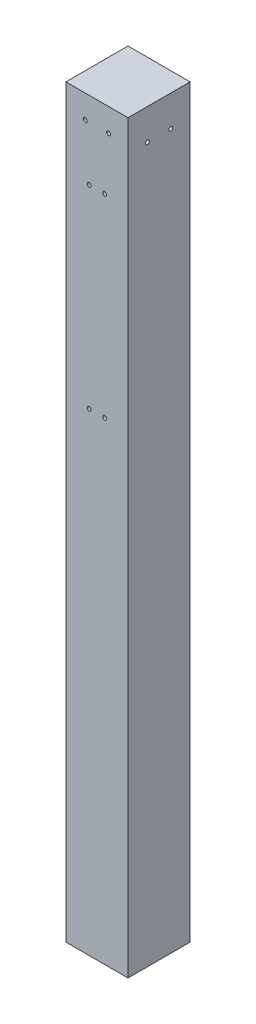
ISO-10303-21;
HEADER;
FILE_DESCRIPTION(('STEP AP214'),'2;1');
FILE_NAME('part.step','',(''),(''),'','','');
FILE_SCHEMA(('AUTOMOTIVE_DESIGN { 1 0 10303 214 1 1 1 1 }'));
ENDSEC;
DATA;
#1=APPLICATION_CONTEXT('core data for automotive mechanical design processes');
#2=APPLICATION_PROTOCOL_DEFINITION('international standard','automotive_design',2000,#1);
#3=PRODUCT_CONTEXT('',#1,'mechanical');
#4=PRODUCT('Part','Part','',(#3));
#5=PRODUCT_RELATED_PRODUCT_CATEGORY('part','',(#4));
#6=PRODUCT_DEFINITION_FORMATION('','',#4);
#7=PRODUCT_DEFINITION_CONTEXT('part definition',#1,'design');
#8=PRODUCT_DEFINITION('design','',#6,#7);
#9=PRODUCT_DEFINITION_SHAPE('','',#8);
#10=(LENGTH_UNIT() NAMED_UNIT(*) SI_UNIT(.MILLI.,.METRE.));
#11=(NAMED_UNIT(*) PLANE_ANGLE_UNIT() SI_UNIT($,.RADIAN.));
#12=(NAMED_UNIT(*) SI_UNIT($,.STERADIAN.) SOLID_ANGLE_UNIT());
#13=UNCERTAINTY_MEASURE_WITH_UNIT(LENGTH_MEASURE(1.E-05),#10,'distance_accuracy_value','');
#14=(GEOMETRIC_REPRESENTATION_CONTEXT(3) GLOBAL_UNCERTAINTY_ASSIGNED_CONTEXT((#13)) GLOBAL_UNIT_ASSIGNED_CONTEXT((#10,
#11,#12)) REPRESENTATION_CONTEXT('',''));
#15=CARTESIAN_POINT('',(0.,0.,0.));
#16=DIRECTION('',(0.,0.,1.));
#17=DIRECTION('',(1.,0.,0.));
#18=AXIS2_PLACEMENT_3D('',#15,#16,#17);
#19=CARTESIAN_POINT('',(-50.8,609.6,50.8));
#20=DIRECTION('',(1.,0.,0.));
#21=DIRECTION('',(0.,0.,-1.));
#22=AXIS2_PLACEMENT_3D('',#19,#20,#21);
#23=PLANE('',#22);
#24=CARTESIAN_POINT('',(-50.8,558.8,19.05));
#25=DIRECTION('',(1.,0.,0.));
#26=DIRECTION('',(0.,0.,-1.));
#27=AXIS2_PLACEMENT_3D('',#24,#25,#26);
#28=CIRCLE('',#27,3.175);
#29=CARTESIAN_POINT('',(-50.8,558.8,15.875));
#30=VERTEX_POINT('',#29);
#31=EDGE_CURVE('E104',#30,#30,#28,.T.);
#32=ORIENTED_EDGE('',*,*,#31,.T.);
#33=EDGE_LOOP('',(#32));
#34=FACE_BOUND('',#33,.T.);
#35=CARTESIAN_POINT('',(-50.8,558.8,-19.05));
#36=DIRECTION('',(1.,0.,0.));
#37=DIRECTION('',(0.,0.,-1.));
#38=AXIS2_PLACEMENT_3D('',#35,#36,#37);
#39=CIRCLE('',#38,3.175);
#40=CARTESIAN_POINT('',(-50.8,558.8,-22.225));
#41=VERTEX_POINT('',#40);
#42=EDGE_CURVE('E118',#41,#41,#39,.T.);
#43=ORIENTED_EDGE('',*,*,#42,.T.);
#44=EDGE_LOOP('',(#43));
#45=FACE_BOUND('',#44,.T.);
#46=DIRECTION('',(0.,0.,1.));
#47=VECTOR('',#46,1.);
#48=CARTESIAN_POINT('',(-50.8,-609.6,50.8));
#49=LINE('',#48,#47);
#50=CARTESIAN_POINT('',(-50.8,-609.6,-50.8));
#51=VERTEX_POINT('',#50);
#52=CARTESIAN_POINT('',(-50.8,-609.6,50.8));
#53=VERTEX_POINT('',#52);
#54=EDGE_CURVE('E101',#51,#53,#49,.T.);
#55=ORIENTED_EDGE('',*,*,#54,.T.);
#56=DIRECTION('',(0.,-1.,0.));
#57=VECTOR('',#56,1.);
#58=CARTESIAN_POINT('',(-50.8,609.6,50.8));
#59=LINE('',#58,#57);
#60=CARTESIAN_POINT('',(-50.8,609.6,50.8));
#61=VERTEX_POINT('',#60);
#62=EDGE_CURVE('E11',#61,#53,#59,.T.);
#63=ORIENTED_EDGE('',*,*,#62,.F.);
#64=DIRECTION('',(0.,0.,1.));
#65=VECTOR('',#64,1.);
#66=CARTESIAN_POINT('',(-50.8,609.6,50.8));
#67=LINE('',#66,#65);
#68=CARTESIAN_POINT('',(-50.8,609.6,-50.8));
#69=VERTEX_POINT('',#68);
#70=EDGE_CURVE('E89',#69,#61,#67,.T.);
#71=ORIENTED_EDGE('',*,*,#70,.F.);
#72=DIRECTION('',(0.,-1.,0.));
#73=VECTOR('',#72,1.);
#74=CARTESIAN_POINT('',(-50.8,609.6,-50.8));
#75=LINE('',#74,#73);
#76=EDGE_CURVE('E97',#69,#51,#75,.T.);
#77=ORIENTED_EDGE('',*,*,#76,.T.);
#78=EDGE_LOOP('',(#55,#63,#71,#77));
#79=FACE_BOUND('',#78,.T.);
#80=ADVANCED_FACE('F38',(#34,#45,#79),#23,.F.);
#81=CARTESIAN_POINT('',(50.8,609.6,50.8));
#82=DIRECTION('',(0.,0.,-1.));
#83=DIRECTION('',(-1.,0.,0.));
#84=AXIS2_PLACEMENT_3D('',#81,#82,#83);
#85=PLANE('',#84);
#86=CARTESIAN_POINT('',(12.7,482.6,50.8));
#87=DIRECTION('',(0.,0.,1.));
#88=DIRECTION('',(1.,0.,0.));
#89=AXIS2_PLACEMENT_3D('',#86,#87,#88);
#90=CIRCLE('',#89,3.175);
#91=CARTESIAN_POINT('',(15.875,482.6,50.8));
#92=VERTEX_POINT('',#91);
#93=EDGE_CURVE('E152',#92,#92,#90,.T.);
#94=ORIENTED_EDGE('',*,*,#93,.F.);
#95=EDGE_LOOP('',(#94));
#96=FACE_BOUND('',#95,.T.);
#97=CARTESIAN_POINT('',(-12.7,165.1,50.8));
#98=DIRECTION('',(0.,0.,1.));
#99=DIRECTION('',(1.,0.,0.));
#100=AXIS2_PLACEMENT_3D('',#97,#98,#99);
#101=CIRCLE('',#100,3.175);
#102=CARTESIAN_POINT('',(-9.52500000000001,165.1,50.8));
#103=VERTEX_POINT('',#102);
#104=EDGE_CURVE('E145',#103,#103,#101,.T.);
#105=ORIENTED_EDGE('',*,*,#104,.F.);
#106=EDGE_LOOP('',(#105));
#107=FACE_BOUND('',#106,.T.);
#108=CARTESIAN_POINT('',(12.7,165.1,50.8));
#109=DIRECTION('',(0.,0.,1.));
#110=DIRECTION('',(1.,0.,0.));
#111=AXIS2_PLACEMENT_3D('',#108,#109,#110);
#112=CIRCLE('',#111,3.175);
#113=CARTESIAN_POINT('',(15.875,165.1,50.8));
#114=VERTEX_POINT('',#113);
#115=EDGE_CURVE('E157',#114,#114,#112,.T.);
#116=ORIENTED_EDGE('',*,*,#115,.F.);
#117=EDGE_LOOP('',(#116));
#118=FACE_BOUND('',#117,.T.);
#119=CARTESIAN_POINT('',(-12.7,482.6,50.8));
#120=DIRECTION('',(0.,0.,1.));
#121=DIRECTION('',(1.,0.,0.));
#122=AXIS2_PLACEMENT_3D('',#119,#120,#121);
#123=CIRCLE('',#122,3.175);
#124=CARTESIAN_POINT('',(-9.52500000000001,482.6,50.8));
#125=VERTEX_POINT('',#124);
#126=EDGE_CURVE('E139',#125,#125,#123,.T.);
#127=ORIENTED_EDGE('',*,*,#126,.F.);
#128=EDGE_LOOP('',(#127));
#129=FACE_BOUND('',#128,.T.);
#130=CARTESIAN_POINT('',(-19.05,571.5,50.8));
#131=DIRECTION('',(0.,0.,1.));
#132=DIRECTION('',(1.,0.,0.));
#133=AXIS2_PLACEMENT_3D('',#130,#131,#132);
#134=CIRCLE('',#133,3.175);
#135=CARTESIAN_POINT('',(-15.875,571.5,50.8));
#136=VERTEX_POINT('',#135);
#137=EDGE_CURVE('E134',#136,#136,#134,.T.);
#138=ORIENTED_EDGE('',*,*,#137,.F.);
#139=EDGE_LOOP('',(#138));
#140=FACE_BOUND('',#139,.T.);
#141=CARTESIAN_POINT('',(19.05,571.5,50.8));
#142=DIRECTION('',(0.,0.,1.));
#143=DIRECTION('',(1.,0.,0.));
#144=AXIS2_PLACEMENT_3D('',#141,#142,#143);
#145=CIRCLE('',#144,3.175);
#146=CARTESIAN_POINT('',(22.225,571.5,50.8));
#147=VERTEX_POINT('',#146);
#148=EDGE_CURVE('E127',#147,#147,#145,.T.);
#149=ORIENTED_EDGE('',*,*,#148,.F.);
#150=EDGE_LOOP('',(#149));
#151=FACE_BOUND('',#150,.T.);
#152=DIRECTION('',(1.,0.,0.));
#153=VECTOR('',#152,1.);
#154=CARTESIAN_POINT('',(50.8,-609.6,50.8));
#155=LINE('',#154,#153);
#156=CARTESIAN_POINT('',(50.8,-609.6,50.8));
#157=VERTEX_POINT('',#156);
#158=EDGE_CURVE('E93',#53,#157,#155,.T.);
#159=ORIENTED_EDGE('',*,*,#158,.T.);
#160=DIRECTION('',(0.,-1.,0.));
#161=VECTOR('',#160,1.);
#162=CARTESIAN_POINT('',(50.8,609.6,50.8));
#163=LINE('',#162,#161);
#164=CARTESIAN_POINT('',(50.8,609.6,50.8));
#165=VERTEX_POINT('',#164);
#166=EDGE_CURVE('E46',#165,#157,#163,.T.);
#167=ORIENTED_EDGE('',*,*,#166,.F.);
#168=DIRECTION('',(1.,0.,0.));
#169=VECTOR('',#168,1.);
#170=CARTESIAN_POINT('',(50.8,609.6,50.8));
#171=LINE('',#170,#169);
#172=EDGE_CURVE('E84',#61,#165,#171,.T.);
#173=ORIENTED_EDGE('',*,*,#172,.F.);
#174=ORIENTED_EDGE('',*,*,#62,.T.);
#175=EDGE_LOOP('',(#159,#167,#173,#174));
#176=FACE_BOUND('',#175,.T.);
#177=ADVANCED_FACE('F92',(#96,#107,#118,#129,#140,#151,#176),#85,.F.);
#178=CARTESIAN_POINT('',(50.8,609.6,50.8));
#179=DIRECTION('',(-1.,0.,0.));
#180=DIRECTION('',(0.,0.,1.));
#181=AXIS2_PLACEMENT_3D('',#178,#179,#180);
#182=PLANE('',#181);
#183=CARTESIAN_POINT('',(50.8,558.8,19.05));
#184=DIRECTION('',(1.,0.,0.));
#185=DIRECTION('',(0.,0.,-1.));
#186=AXIS2_PLACEMENT_3D('',#183,#184,#185);
#187=CIRCLE('',#186,3.175);
#188=CARTESIAN_POINT('',(50.8,558.8,15.875));
#189=VERTEX_POINT('',#188);
#190=EDGE_CURVE('E122',#189,#189,#187,.T.);
#191=ORIENTED_EDGE('',*,*,#190,.F.);
#192=EDGE_LOOP('',(#191));
#193=FACE_BOUND('',#192,.T.);
#194=CARTESIAN_POINT('',(50.8,558.8,-19.05));
#195=DIRECTION('',(1.,0.,0.));
#196=DIRECTION('',(0.,0.,-1.));
#197=AXIS2_PLACEMENT_3D('',#194,#195,#196);
#198=CIRCLE('',#197,3.175);
#199=CARTESIAN_POINT('',(50.8,558.8,-22.225));
#200=VERTEX_POINT('',#199);
#201=EDGE_CURVE('E115',#200,#200,#198,.T.);
#202=ORIENTED_EDGE('',*,*,#201,.F.);
#203=EDGE_LOOP('',(#202));
#204=FACE_BOUND('',#203,.T.);
#205=DIRECTION('',(0.,0.,-1.));
#206=VECTOR('',#205,1.);
#207=CARTESIAN_POINT('',(50.8,-609.6,50.8));
#208=LINE('',#207,#206);
#209=CARTESIAN_POINT('',(50.8,-609.6,-50.8));
#210=VERTEX_POINT('',#209);
#211=EDGE_CURVE('E71',#157,#210,#208,.T.);
#212=ORIENTED_EDGE('',*,*,#211,.T.);
#213=DIRECTION('',(0.,-1.,0.));
#214=VECTOR('',#213,1.);
#215=CARTESIAN_POINT('',(50.8,609.6,-50.8));
#216=LINE('',#215,#214);
#217=CARTESIAN_POINT('',(50.8,609.6,-50.8));
#218=VERTEX_POINT('',#217);
#219=EDGE_CURVE('E94',#218,#210,#216,.T.);
#220=ORIENTED_EDGE('',*,*,#219,.F.);
#221=DIRECTION('',(0.,0.,-1.));
#222=VECTOR('',#221,1.);
#223=CARTESIAN_POINT('',(50.8,609.6,50.8));
#224=LINE('',#223,#222);
#225=EDGE_CURVE('E87',#165,#218,#224,.T.);
#226=ORIENTED_EDGE('',*,*,#225,.F.);
#227=ORIENTED_EDGE('',*,*,#166,.T.);
#228=EDGE_LOOP('',(#212,#220,#226,#227));
#229=FACE_BOUND('',#228,.T.);
#230=ADVANCED_FACE('F95',(#193,#204,#229),#182,.F.);
#231=CARTESIAN_POINT('',(50.8,609.6,-50.8));
#232=DIRECTION('',(0.,0.,1.));
#233=DIRECTION('',(1.,0.,0.));
#234=AXIS2_PLACEMENT_3D('',#231,#232,#233);
#235=PLANE('',#234);
#236=CARTESIAN_POINT('',(-19.05,571.5,-50.8));
#237=DIRECTION('',(0.,0.,1.));
#238=DIRECTION('',(1.,0.,0.));
#239=AXIS2_PLACEMENT_3D('',#236,#237,#238);
#240=CIRCLE('',#239,3.175);
#241=CARTESIAN_POINT('',(-15.875,571.5,-50.8));
#242=VERTEX_POINT('',#241);
#243=EDGE_CURVE('E119',#242,#242,#240,.T.);
#244=ORIENTED_EDGE('',*,*,#243,.T.);
#245=EDGE_LOOP('',(#244));
#246=FACE_BOUND('',#245,.T.);
#247=CARTESIAN_POINT('',(19.05,571.5,-50.8));
#248=DIRECTION('',(0.,0.,1.));
#249=DIRECTION('',(1.,0.,0.));
#250=AXIS2_PLACEMENT_3D('',#247,#248,#249);
#251=CIRCLE('',#250,3.175);
#252=CARTESIAN_POINT('',(22.225,571.5,-50.8));
#253=VERTEX_POINT('',#252);
#254=EDGE_CURVE('E130',#253,#253,#251,.T.);
#255=ORIENTED_EDGE('',*,*,#254,.T.);
#256=EDGE_LOOP('',(#255));
#257=FACE_BOUND('',#256,.T.);
#258=DIRECTION('',(-1.,0.,0.));
#259=VECTOR('',#258,1.);
#260=CARTESIAN_POINT('',(50.8,-609.6,-50.8));
#261=LINE('',#260,#259);
#262=EDGE_CURVE('E77',#210,#51,#261,.T.);
#263=ORIENTED_EDGE('',*,*,#262,.T.);
#264=ORIENTED_EDGE('',*,*,#76,.F.);
#265=DIRECTION('',(-1.,0.,0.));
#266=VECTOR('',#265,1.);
#267=CARTESIAN_POINT('',(50.8,609.6,-50.8));
#268=LINE('',#267,#266);
#269=EDGE_CURVE('E54',#218,#69,#268,.T.);
#270=ORIENTED_EDGE('',*,*,#269,.F.);
#271=ORIENTED_EDGE('',*,*,#219,.T.);
#272=EDGE_LOOP('',(#263,#264,#270,#271));
#273=FACE_BOUND('',#272,.T.);
#274=ADVANCED_FACE('F109',(#246,#257,#273),#235,.F.);
#275=CARTESIAN_POINT('',(0.,609.6,0.));
#276=DIRECTION('',(0.,1.,0.));
#277=DIRECTION('',(0.,0.,1.));
#278=AXIS2_PLACEMENT_3D('',#275,#276,#277);
#279=PLANE('',#278);
#280=ORIENTED_EDGE('',*,*,#70,.T.);
#281=ORIENTED_EDGE('',*,*,#172,.T.);
#282=ORIENTED_EDGE('',*,*,#225,.T.);
#283=ORIENTED_EDGE('',*,*,#269,.T.);
#284=EDGE_LOOP('',(#280,#281,#282,#283));
#285=FACE_BOUND('',#284,.T.);
#286=ADVANCED_FACE('F85',(#285),#279,.T.);
#287=CARTESIAN_POINT('',(0.,-609.6,0.));
#288=DIRECTION('',(0.,1.,0.));
#289=DIRECTION('',(0.,0.,1.));
#290=AXIS2_PLACEMENT_3D('',#287,#288,#289);
#291=PLANE('',#290);
#292=ORIENTED_EDGE('',*,*,#54,.F.);
#293=ORIENTED_EDGE('',*,*,#262,.F.);
#294=ORIENTED_EDGE('',*,*,#211,.F.);
#295=ORIENTED_EDGE('',*,*,#158,.F.);
#296=EDGE_LOOP('',(#292,#293,#294,#295));
#297=FACE_BOUND('',#296,.T.);
#298=ADVANCED_FACE('F112',(#297),#291,.F.);
#299=CARTESIAN_POINT('',(-50.8,558.8,-19.05));
#300=DIRECTION('',(1.,0.,0.));
#301=DIRECTION('',(0.,0.,-1.));
#302=AXIS2_PLACEMENT_3D('',#299,#300,#301);
#303=CYLINDRICAL_SURFACE('',#302,3.175);
#304=ORIENTED_EDGE('',*,*,#42,.F.);
#305=EDGE_LOOP('',(#304));
#306=FACE_BOUND('',#305,.T.);
#307=ORIENTED_EDGE('',*,*,#201,.T.);
#308=EDGE_LOOP('',(#307));
#309=FACE_BOUND('',#308,.T.);
#310=ADVANCED_FACE('F194',(#306,#309),#303,.F.);
#311=CARTESIAN_POINT('',(-50.8,558.8,19.05));
#312=DIRECTION('',(1.,0.,0.));
#313=DIRECTION('',(0.,0.,-1.));
#314=AXIS2_PLACEMENT_3D('',#311,#312,#313);
#315=CYLINDRICAL_SURFACE('',#314,3.175);
#316=ORIENTED_EDGE('',*,*,#31,.F.);
#317=EDGE_LOOP('',(#316));
#318=FACE_BOUND('',#317,.T.);
#319=ORIENTED_EDGE('',*,*,#190,.T.);
#320=EDGE_LOOP('',(#319));
#321=FACE_BOUND('',#320,.T.);
#322=ADVANCED_FACE('F184',(#318,#321),#315,.F.);
#323=CARTESIAN_POINT('',(19.05,571.5,-50.8));
#324=DIRECTION('',(0.,0.,1.));
#325=DIRECTION('',(1.,0.,0.));
#326=AXIS2_PLACEMENT_3D('',#323,#324,#325);
#327=CYLINDRICAL_SURFACE('',#326,3.175);
#328=ORIENTED_EDGE('',*,*,#254,.F.);
#329=EDGE_LOOP('',(#328));
#330=FACE_BOUND('',#329,.T.);
#331=ORIENTED_EDGE('',*,*,#148,.T.);
#332=EDGE_LOOP('',(#331));
#333=FACE_BOUND('',#332,.T.);
#334=ADVANCED_FACE('F181',(#330,#333),#327,.F.);
#335=CARTESIAN_POINT('',(-19.05,571.5,-50.8));
#336=DIRECTION('',(0.,0.,1.));
#337=DIRECTION('',(1.,0.,0.));
#338=AXIS2_PLACEMENT_3D('',#335,#336,#337);
#339=CYLINDRICAL_SURFACE('',#338,3.175);
#340=ORIENTED_EDGE('',*,*,#243,.F.);
#341=EDGE_LOOP('',(#340));
#342=FACE_BOUND('',#341,.T.);
#343=ORIENTED_EDGE('',*,*,#137,.T.);
#344=EDGE_LOOP('',(#343));
#345=FACE_BOUND('',#344,.T.);
#346=ADVANCED_FACE('F183',(#342,#345),#339,.F.);
#347=CARTESIAN_POINT('',(-12.7,482.6,6.34999999999999));
#348=DIRECTION('',(0.,0.,1.));
#349=DIRECTION('',(1.,0.,0.));
#350=AXIS2_PLACEMENT_3D('',#347,#348,#349);
#351=CYLINDRICAL_SURFACE('',#350,3.175);
#352=CARTESIAN_POINT('',(-12.7,482.6,6.34999999999999));
#353=DIRECTION('',(0.,0.,1.));
#354=DIRECTION('',(1.,0.,0.));
#355=AXIS2_PLACEMENT_3D('',#352,#353,#354);
#356=CIRCLE('',#355,3.175);
#357=CARTESIAN_POINT('',(-9.52500000000001,482.6,6.34999999999999));
#358=VERTEX_POINT('',#357);
#359=EDGE_CURVE('E131',#358,#358,#356,.T.);
#360=ORIENTED_EDGE('',*,*,#359,.F.);
#361=EDGE_LOOP('',(#360));
#362=FACE_BOUND('',#361,.T.);
#363=ORIENTED_EDGE('',*,*,#126,.T.);
#364=EDGE_LOOP('',(#363));
#365=FACE_BOUND('',#364,.T.);
#366=ADVANCED_FACE('F191',(#362,#365),#351,.F.);
#367=CARTESIAN_POINT('',(-12.7,482.6,6.34999999999999));
#368=DIRECTION('',(0.,0.,1.));
#369=DIRECTION('',(1.,0.,0.));
#370=AXIS2_PLACEMENT_3D('',#367,#368,#369);
#371=PLANE('',#370);
#372=ORIENTED_EDGE('',*,*,#359,.T.);
#373=EDGE_LOOP('',(#372));
#374=FACE_BOUND('',#373,.T.);
#375=ADVANCED_FACE('F168',(#374),#371,.T.);
#376=CARTESIAN_POINT('',(12.7,165.1,6.34999999999999));
#377=DIRECTION('',(0.,0.,1.));
#378=DIRECTION('',(1.,0.,0.));
#379=AXIS2_PLACEMENT_3D('',#376,#377,#378);
#380=CYLINDRICAL_SURFACE('',#379,3.175);
#381=CARTESIAN_POINT('',(12.7,165.1,6.34999999999999));
#382=DIRECTION('',(0.,0.,1.));
#383=DIRECTION('',(1.,0.,0.));
#384=AXIS2_PLACEMENT_3D('',#381,#382,#383);
#385=CIRCLE('',#384,3.175);
#386=CARTESIAN_POINT('',(15.875,165.1,6.34999999999999));
#387=VERTEX_POINT('',#386);
#388=EDGE_CURVE('E149',#387,#387,#385,.T.);
#389=ORIENTED_EDGE('',*,*,#388,.F.);
#390=EDGE_LOOP('',(#389));
#391=FACE_BOUND('',#390,.T.);
#392=ORIENTED_EDGE('',*,*,#115,.T.);
#393=EDGE_LOOP('',(#392));
#394=FACE_BOUND('',#393,.T.);
#395=ADVANCED_FACE('F165',(#391,#394),#380,.F.);
#396=CARTESIAN_POINT('',(12.7,165.1,6.34999999999999));
#397=DIRECTION('',(0.,0.,1.));
#398=DIRECTION('',(1.,0.,0.));
#399=AXIS2_PLACEMENT_3D('',#396,#397,#398);
#400=PLANE('',#399);
#401=ORIENTED_EDGE('',*,*,#388,.T.);
#402=EDGE_LOOP('',(#401));
#403=FACE_BOUND('',#402,.T.);
#404=ADVANCED_FACE('F163',(#403),#400,.T.);
#405=CARTESIAN_POINT('',(-12.7,165.1,6.34999999999999));
#406=DIRECTION('',(0.,0.,1.));
#407=DIRECTION('',(1.,0.,0.));
#408=AXIS2_PLACEMENT_3D('',#405,#406,#407);
#409=CYLINDRICAL_SURFACE('',#408,3.175);
#410=CARTESIAN_POINT('',(-12.7,165.1,6.34999999999999));
#411=DIRECTION('',(0.,0.,1.));
#412=DIRECTION('',(1.,0.,0.));
#413=AXIS2_PLACEMENT_3D('',#410,#411,#412);
#414=CIRCLE('',#413,3.175);
#415=CARTESIAN_POINT('',(-9.52500000000001,165.1,6.34999999999999));
#416=VERTEX_POINT('',#415);
#417=EDGE_CURVE('E148',#416,#416,#414,.T.);
#418=ORIENTED_EDGE('',*,*,#417,.F.);
#419=EDGE_LOOP('',(#418));
#420=FACE_BOUND('',#419,.T.);
#421=ORIENTED_EDGE('',*,*,#104,.T.);
#422=EDGE_LOOP('',(#421));
#423=FACE_BOUND('',#422,.T.);
#424=ADVANCED_FACE('F295',(#420,#423),#409,.F.);
#425=CARTESIAN_POINT('',(-12.7,165.1,6.34999999999999));
#426=DIRECTION('',(0.,0.,1.));
#427=DIRECTION('',(1.,0.,0.));
#428=AXIS2_PLACEMENT_3D('',#425,#426,#427);
#429=PLANE('',#428);
#430=ORIENTED_EDGE('',*,*,#417,.T.);
#431=EDGE_LOOP('',(#430));
#432=FACE_BOUND('',#431,.T.);
#433=ADVANCED_FACE('F304',(#432),#429,.T.);
#434=CARTESIAN_POINT('',(12.7,482.6,6.34999999999999));
#435=DIRECTION('',(0.,0.,1.));
#436=DIRECTION('',(1.,0.,0.));
#437=AXIS2_PLACEMENT_3D('',#434,#435,#436);
#438=CYLINDRICAL_SURFACE('',#437,3.175);
#439=CARTESIAN_POINT('',(12.7,482.6,6.34999999999999));
#440=DIRECTION('',(0.,0.,1.));
#441=DIRECTION('',(1.,0.,0.));
#442=AXIS2_PLACEMENT_3D('',#439,#440,#441);
#443=CIRCLE('',#442,3.175);
#444=CARTESIAN_POINT('',(15.875,482.6,6.34999999999999));
#445=VERTEX_POINT('',#444);
#446=EDGE_CURVE('E142',#445,#445,#443,.T.);
#447=ORIENTED_EDGE('',*,*,#446,.F.);
#448=EDGE_LOOP('',(#447));
#449=FACE_BOUND('',#448,.T.);
#450=ORIENTED_EDGE('',*,*,#93,.T.);
#451=EDGE_LOOP('',(#450));
#452=FACE_BOUND('',#451,.T.);
#453=ADVANCED_FACE('F314',(#449,#452),#438,.F.);
#454=CARTESIAN_POINT('',(12.7,482.6,6.34999999999999));
#455=DIRECTION('',(0.,0.,1.));
#456=DIRECTION('',(1.,0.,0.));
#457=AXIS2_PLACEMENT_3D('',#454,#455,#456);
#458=PLANE('',#457);
#459=ORIENTED_EDGE('',*,*,#446,.T.);
#460=EDGE_LOOP('',(#459));
#461=FACE_BOUND('',#460,.T.);
#462=ADVANCED_FACE('F324',(#461),#458,.T.);
#463=CLOSED_SHELL('',(#80,#177,#230,#274,#286,#298,#310,#322,#334,#346,#366,#375,#395,#404,#424,
#433,#453,#462));
#464=MANIFOLD_SOLID_BREP('B2',#463);
#465=ADVANCED_BREP_SHAPE_REPRESENTATION('',(#18,#464),#14);
#466=SHAPE_DEFINITION_REPRESENTATION(#9,#465);
ENDSEC;
END-ISO-10303-21;
